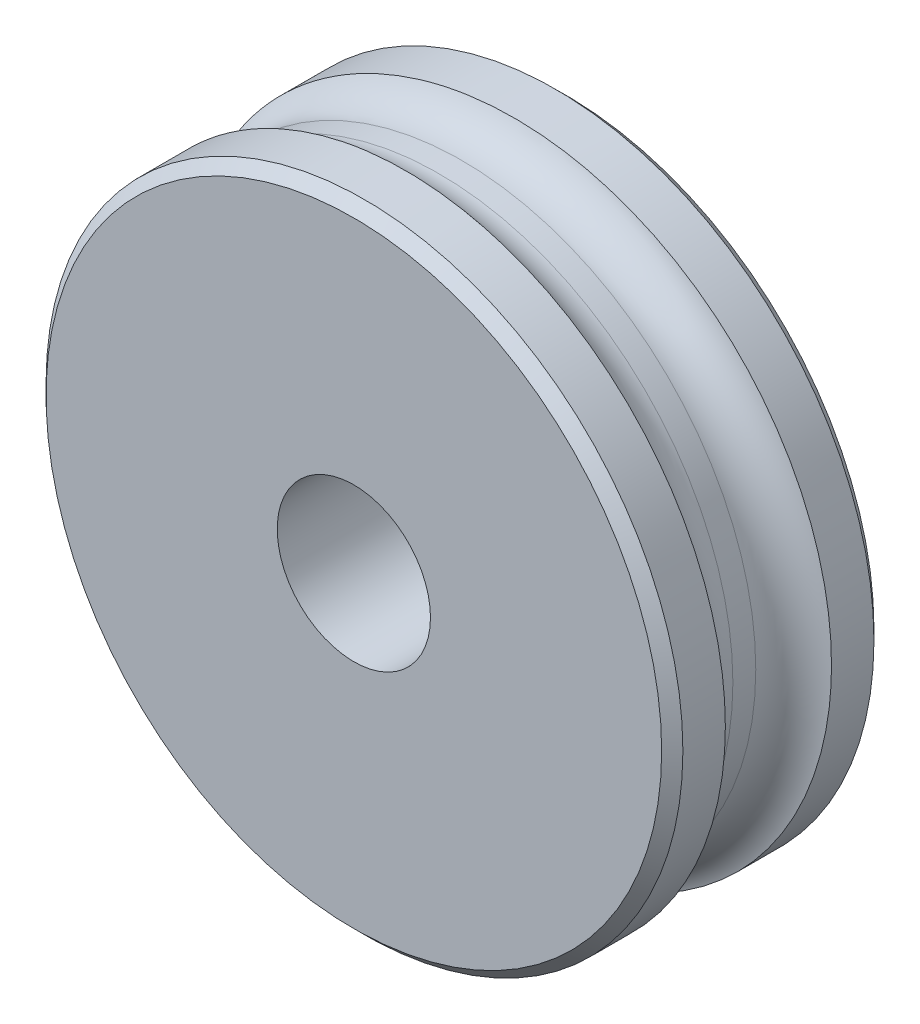
ISO-10303-21;
HEADER;
FILE_DESCRIPTION(('STEP AP214'),'2;1');
FILE_NAME('part.step','',(''),(''),'','','');
FILE_SCHEMA(('AUTOMOTIVE_DESIGN { 1 0 10303 214 1 1 1 1 }'));
ENDSEC;
DATA;
#1=APPLICATION_CONTEXT('core data for automotive mechanical design processes');
#2=APPLICATION_PROTOCOL_DEFINITION('international standard','automotive_design',2000,#1);
#3=PRODUCT_CONTEXT('',#1,'mechanical');
#4=PRODUCT('Part','Part','',(#3));
#5=PRODUCT_RELATED_PRODUCT_CATEGORY('part','',(#4));
#6=PRODUCT_DEFINITION_FORMATION('','',#4);
#7=PRODUCT_DEFINITION_CONTEXT('part definition',#1,'design');
#8=PRODUCT_DEFINITION('design','',#6,#7);
#9=PRODUCT_DEFINITION_SHAPE('','',#8);
#10=(LENGTH_UNIT() NAMED_UNIT(*) SI_UNIT(.MILLI.,.METRE.));
#11=(NAMED_UNIT(*) PLANE_ANGLE_UNIT() SI_UNIT($,.RADIAN.));
#12=(NAMED_UNIT(*) SI_UNIT($,.STERADIAN.) SOLID_ANGLE_UNIT());
#13=UNCERTAINTY_MEASURE_WITH_UNIT(LENGTH_MEASURE(1.E-05),#10,'distance_accuracy_value','');
#14=(GEOMETRIC_REPRESENTATION_CONTEXT(3) GLOBAL_UNCERTAINTY_ASSIGNED_CONTEXT((#13)) GLOBAL_UNIT_ASSIGNED_CONTEXT((#10,
#11,#12)) REPRESENTATION_CONTEXT('',''));
#15=CARTESIAN_POINT('',(0.,0.,0.));
#16=DIRECTION('',(0.,0.,1.));
#17=DIRECTION('',(1.,0.,0.));
#18=AXIS2_PLACEMENT_3D('',#15,#16,#17);
#19=CARTESIAN_POINT('',(-297.670899950721,626.415366790637,-139.445627484166));
#20=DIRECTION('',(0.,0.,1.));
#21=DIRECTION('',(1.,0.,0.));
#22=AXIS2_PLACEMENT_3D('',#19,#20,#21);
#23=CYLINDRICAL_SURFACE('',#22,59.9999999997861);
#24=CARTESIAN_POINT('',(-297.670899950721,626.415366790637,32.26));
#25=DIRECTION('',(0.,0.,1.));
#26=DIRECTION('',(1.,0.,0.));
#27=AXIS2_PLACEMENT_3D('',#24,#25,#26);
#28=CIRCLE('',#27,59.9999999997861);
#29=CARTESIAN_POINT('',(-237.670899950935,626.415366790637,32.26));
#30=VERTEX_POINT('',#29);
#31=EDGE_CURVE('E50',#30,#30,#28,.T.);
#32=ORIENTED_EDGE('',*,*,#31,.T.);
#33=EDGE_LOOP('',(#32));
#34=FACE_BOUND('',#33,.T.);
#35=CARTESIAN_POINT('',(-336.420477547887,580.606303975343,41.5272521517537));
#36=CARTESIAN_POINT('',(-335.390338737614,579.734915453957,41.5051684799978));
#37=CARTESIAN_POINT('',(-334.330806938694,578.898308766413,41.4828163092265));
#38=CARTESIAN_POINT('',(-332.70125401925,577.698537391911,41.4490363728457));
#39=CARTESIAN_POINT('',(-332.151356937595,577.30780110102,41.4377343757435));
#40=CARTESIAN_POINT('',(-331.038617325716,576.545029715684,41.415066736645));
#41=CARTESIAN_POINT('',(-330.47577276904,576.172997578115,41.4037010848993));
#42=CARTESIAN_POINT('',(-328.76848522588,575.085441406517,41.3695378593218));
#43=CARTESIAN_POINT('',(-327.605560322874,574.398657823888,41.3466796629169));
#44=CARTESIAN_POINT('',(-325.235986466903,573.105065414893,41.3009835214889));
#45=CARTESIAN_POINT('',(-324.029334894191,572.498261390387,41.2781455777633));
#46=CARTESIAN_POINT('',(-322.037956682287,571.579630264985,41.2411915939157));
#47=CARTESIAN_POINT('',(-321.264782511037,571.242548122738,41.2270179736366));
#48=CARTESIAN_POINT('',(-319.705014341062,570.601312837427,41.1987812408852));
#49=CARTESIAN_POINT('',(-318.918422550075,570.297154336461,41.1847181107784));
#50=CARTESIAN_POINT('',(-317.332945731991,569.722200320451,41.1567324552621));
#51=CARTESIAN_POINT('',(-316.534058211142,569.451411676331,41.1428099593494));
#52=CARTESIAN_POINT('',(-314.925596721631,568.943748118392,41.1151414099863));
#53=CARTESIAN_POINT('',(-314.116022296382,568.706874658725,41.1013953641243));
#54=CARTESIAN_POINT('',(-311.672676997128,568.047604036124,41.0604559653316));
#55=CARTESIAN_POINT('',(-310.02467139317,567.676697035878,41.0335681935529));
#56=CARTESIAN_POINT('',(-306.703533276097,567.075157439392,40.9808426819324));
#57=CARTESIAN_POINT('',(-305.030401682049,566.844519725079,40.9550049038112));
#58=CARTESIAN_POINT('',(-301.670921640349,566.525085333743,40.9045567373098));
#59=CARTESIAN_POINT('',(-299.984575988505,566.436259425484,40.879946096997));
#60=CARTESIAN_POINT('',(-296.61037905059,566.401017658774,40.8320893663977));
#61=CARTESIAN_POINT('',(-294.922527751608,566.454603033484,40.808843287929));
#62=CARTESIAN_POINT('',(-291.557516027334,566.703789222089,40.7638249257233));
#63=CARTESIAN_POINT('',(-289.880354373483,566.899373407962,40.7420524697519));
#64=CARTESIAN_POINT('',(-286.548458324711,567.43115378131,40.7000522379598));
#65=CARTESIAN_POINT('',(-284.893723880575,567.767349660161,40.6798244587488));
#66=CARTESIAN_POINT('',(-281.618555561482,568.577939551472,40.6409580301012));
#67=CARTESIAN_POINT('',(-279.99811940007,569.052324320404,40.6223192744817));
#68=CARTESIAN_POINT('',(-276.802957310503,570.135931921532,40.5866449817444));
#69=CARTESIAN_POINT('',(-275.228231403314,570.745154815567,40.5696094453618));
#70=CARTESIAN_POINT('',(-272.135662812471,572.094121979662,40.537132461471));
#71=CARTESIAN_POINT('',(-270.617821145544,572.833868581301,40.5216910424468));
#72=CARTESIAN_POINT('',(-267.649847158901,574.438618034869,40.492372769712));
#73=CARTESIAN_POINT('',(-266.199714829011,575.303620867973,40.4784959157663));
#74=CARTESIAN_POINT('',(-263.377620620415,577.15263779429,40.4522608007537));
#75=CARTESIAN_POINT('',(-262.005650655969,578.136639544293,40.4399023824541));
#76=CARTESIAN_POINT('',(-259.349475732921,580.216730915203,40.4166413993295));
#77=CARTESIAN_POINT('',(-258.065270769385,581.31282052981,40.4057388344228));
#78=CARTESIAN_POINT('',(-255.593760521462,583.609293951825,40.3853184729911));
#79=CARTESIAN_POINT('',(-254.406455101152,584.809677612934,40.3758006745237));
#80=CARTESIAN_POINT('',(-252.137185686356,587.306206418373,40.3580724134901));
#81=CARTESIAN_POINT('',(-251.055221690575,588.602351561526,40.3498619509078));
#82=CARTESIAN_POINT('',(-249.004372696069,591.28113181703,40.3346685501663));
#83=CARTESIAN_POINT('',(-248.035482955486,592.663763298771,40.3276855605258));
#84=CARTESIAN_POINT('',(-246.217619619523,595.505735583946,40.3148673208376));
#85=CARTESIAN_POINT('',(-245.368646020194,596.965076384855,40.309032070752));
#86=CARTESIAN_POINT('',(-243.796652408752,599.950091072501,40.2984339269994));
#87=CARTESIAN_POINT('',(-243.073632300577,601.475764908646,40.2936710325145));
#88=CARTESIAN_POINT('',(-241.758686005468,604.582599934088,40.2851491437985));
#89=CARTESIAN_POINT('',(-241.16675981884,606.163761123514,40.2813901495697));
#90=CARTESIAN_POINT('',(-240.118215211914,609.370314426313,40.2748171552226));
#91=CARTESIAN_POINT('',(-239.661595518087,610.995706123225,40.27200314621));
#92=CARTESIAN_POINT('',(-238.88690310518,614.279179141533,40.2672728490697));
#93=CARTESIAN_POINT('',(-238.568830384966,615.937260462663,40.2653565609346));
#94=CARTESIAN_POINT('',(-238.073493367225,619.274325528822,40.2623878966913));
#95=CARTESIAN_POINT('',(-237.896229133147,620.953309283271,40.2613355209724));
#96=CARTESIAN_POINT('',(-237.683769702923,624.320241921251,40.2600755257337));
#97=CARTESIAN_POINT('',(-237.64857450717,626.008190804808,40.2598679062162));
#98=CARTESIAN_POINT('',(-237.720503401451,629.381053579742,40.2602935876915));
#99=CARTESIAN_POINT('',(-237.827627506833,631.065967470792,40.2609268887748));
#100=CARTESIAN_POINT('',(-238.183433361709,634.420781350639,40.2630460501652));
#101=CARTESIAN_POINT('',(-238.432115111081,636.090681339449,40.2645319104715));
#102=CARTESIAN_POINT('',(-239.069268022492,639.403595121794,40.2683828709181));
#103=CARTESIAN_POINT('',(-239.457739159166,641.046608920205,40.2707479708989));
#104=CARTESIAN_POINT('',(-240.371708725979,644.29406977884,40.276398191295));
#105=CARTESIAN_POINT('',(-240.897207156044,645.898516839084,40.2796833117099));
#106=CARTESIAN_POINT('',(-242.08149484802,649.057437581984,40.2872269601124));
#107=CARTESIAN_POINT('',(-242.740284112084,650.611911263833,40.2914854881156));
#108=CARTESIAN_POINT('',(-244.18646917881,653.659833858136,40.3010400009439));
#109=CARTESIAN_POINT('',(-244.973864981333,655.153282770655,40.3063359857678));
#110=CARTESIAN_POINT('',(-246.671664294797,658.06853838403,40.3180377114671));
#111=CARTESIAN_POINT('',(-247.582067806487,659.490345084449,40.3244434523492));
#112=CARTESIAN_POINT('',(-249.51940892359,662.252208260078,40.3384424768131));
#113=CARTESIAN_POINT('',(-250.54634652889,663.592264735365,40.3460357603936));
#114=CARTESIAN_POINT('',(-252.709453244775,666.181100594274,40.3624900279762));
#115=CARTESIAN_POINT('',(-253.845622333965,667.429879995772,40.37135101173));
#116=CARTESIAN_POINT('',(-256.219112963788,669.827284591884,40.3904198731803));
#117=CARTESIAN_POINT('',(-257.456434503997,670.975909786916,40.4006277508713));
#118=CARTESIAN_POINT('',(-260.023431361182,673.164840922984,40.4224650646027));
#119=CARTESIAN_POINT('',(-261.353106671435,674.205146871905,40.4340945005396));
#120=CARTESIAN_POINT('',(-264.095355830794,676.170045224946,40.458841417729));
#121=CARTESIAN_POINT('',(-265.507929680625,677.094637628054,40.4719588989945));
#122=CARTESIAN_POINT('',(-268.405946409601,678.821546799307,40.4997366212108));
#123=CARTESIAN_POINT('',(-269.891390053005,679.62386228465,40.5143968783442));
#124=CARTESIAN_POINT('',(-272.924569801743,681.100504692142,40.5452989920591));
#125=CARTESIAN_POINT('',(-274.472305906972,681.774831614507,40.5615408486381));
#126=CARTESIAN_POINT('',(-277.619065192165,682.990706242801,40.5956258412935));
#127=CARTESIAN_POINT('',(-279.218088372171,683.532253948617,40.6134689773714));
#128=CARTESIAN_POINT('',(-282.456052390522,684.478724154079,40.6507534482883));
#129=CARTESIAN_POINT('',(-284.094993230371,684.883646648576,40.6701947831877));
#130=CARTESIAN_POINT('',(-287.401215071871,685.554007482414,40.7106474117194));
#131=CARTESIAN_POINT('',(-289.068497353654,685.819439503848,40.7316587764134));
#132=CARTESIAN_POINT('',(-292.419475822244,686.208909342816,40.7751924373413));
#133=CARTESIAN_POINT('',(-294.10317200937,686.332947157614,40.7977147336044));
#134=CARTESIAN_POINT('',(-297.475009860781,686.438751815856,40.8441802295121));
#135=CARTESIAN_POINT('',(-299.16315152731,686.420518587456,40.8681234298742));
#136=CARTESIAN_POINT('',(-302.531880088178,686.24191550201,40.9173066639237));
#137=CARTESIAN_POINT('',(-304.212466981945,686.0815456342,40.9425466977094));
#138=CARTESIAN_POINT('',(-307.554305378687,685.619791039846,40.9941663101762));
#139=CARTESIAN_POINT('',(-309.215554972756,685.318392510455,41.0205460001692));
#140=CARTESIAN_POINT('',(-312.506743585365,684.576722034981,41.0742459175582));
#141=CARTESIAN_POINT('',(-314.13668260197,684.136450080319,41.1015661450125));
#142=CARTESIAN_POINT('',(-317.353666767785,683.120165062926,41.1569132680182));
#143=CARTESIAN_POINT('',(-318.940711901231,682.544151950312,41.1849401638294));
#144=CARTESIAN_POINT('',(-322.060629688501,681.260480601453,41.2414301576758));
#145=CARTESIAN_POINT('',(-323.593502338309,680.552822355445,41.2698932557434));
#146=CARTESIAN_POINT('',(-326.59435398994,679.010802568479,41.3269535114664));
#147=CARTESIAN_POINT('',(-328.062325564293,678.176426573777,41.3555506840536));
#148=CARTESIAN_POINT('',(-330.922755124868,676.386960617205,41.4125382868284));
#149=CARTESIAN_POINT('',(-332.315213104064,675.431870644102,41.4409287169967));
#150=CARTESIAN_POINT('',(-335.014719206701,673.407762483595,41.4971374731274));
#151=CARTESIAN_POINT('',(-336.321767238814,672.338744174369,41.524955798478));
#152=CARTESIAN_POINT('',(-338.841159950071,670.094375750459,41.579632917506));
#153=CARTESIAN_POINT('',(-340.053504631265,668.919025638076,41.6064917112041));
#154=CARTESIAN_POINT('',(-342.374887504666,666.470326226705,41.6588481653578));
#155=CARTESIAN_POINT('',(-343.483924162075,665.196975472279,41.684345805589));
#156=CARTESIAN_POINT('',(-345.590782272501,662.561338029531,41.7335719850688));
#157=CARTESIAN_POINT('',(-346.588603720774,661.199051337415,41.7573005242418));
#158=CARTESIAN_POINT('',(-348.465931826734,658.395222817103,41.802586009785));
#159=CARTESIAN_POINT('',(-349.345438426019,656.953680949785,41.824142955083));
#160=CARTESIAN_POINT('',(-350.979875315718,654.00158980506,41.8646996269861));
#161=CARTESIAN_POINT('',(-351.734805629955,652.49104054085,41.88369935408));
#162=CARTESIAN_POINT('',(-353.114584619525,649.41196276746,41.9187822494819));
#163=CARTESIAN_POINT('',(-353.739457570809,647.843445142886,41.9348659620084));
#164=CARTESIAN_POINT('',(-354.854848795185,644.659316107692,41.9638077215857));
#165=CARTESIAN_POINT('',(-355.345367071352,643.043704698149,41.9766657687105));
#166=CARTESIAN_POINT('',(-356.188546313836,639.776906576751,41.9988971587921));
#167=CARTESIAN_POINT('',(-356.541209679916,638.125720484704,42.0082705624091));
#168=CARTESIAN_POINT('',(-357.106177226172,634.799492024466,42.0233395846539));
#169=CARTESIAN_POINT('',(-357.318481501195,633.124449672396,42.0290352057671));
#170=CARTESIAN_POINT('',(-357.60116830827,629.763013576818,42.0366278696003));
#171=CARTESIAN_POINT('',(-357.67160041093,628.076624004777,42.0385262390913));
#172=CARTESIAN_POINT('',(-357.670188986112,624.703900481741,42.0384882420264));
#173=CARTESIAN_POINT('',(-357.598345225108,623.017566530843,42.0365518691763));
#174=CARTESIAN_POINT('',(-357.312882221131,619.656789913627,42.0288849947053));
#175=CARTESIAN_POINT('',(-357.099249251165,617.982348414515,42.0231541257291));
#176=CARTESIAN_POINT('',(-356.531709275388,614.657423038535,42.0080178547962));
#177=CARTESIAN_POINT('',(-356.177803345394,613.006938978028,41.9986124810209));
#178=CARTESIAN_POINT('',(-355.332248367421,609.741619298684,41.9763213441104));
#179=CARTESIAN_POINT('',(-354.84059085971,608.126785875832,41.9634353672228));
#180=CARTESIAN_POINT('',(-353.722892674342,604.944038811823,41.9344386011697));
#181=CARTESIAN_POINT('',(-353.096847660406,603.376126686534,41.9183277079471));
#182=CARTESIAN_POINT('',(-352.060767344543,601.068695210759,41.8919892522125));
#183=CARTESIAN_POINT('',(-351.699269583944,600.307013676227,41.8828485244787));
#184=CARTESIAN_POINT('',(-350.944502943415,598.799547780111,41.8638845312272));
#185=CARTESIAN_POINT('',(-350.551235520257,598.053762691588,41.8540612970082));
#186=CARTESIAN_POINT('',(-349.733710134164,596.579581262885,41.8337797043477));
#187=CARTESIAN_POINT('',(-349.309458178502,595.85118158817,41.8233214690861));
#188=CARTESIAN_POINT('',(-348.430593831908,594.412803915703,41.8018140244754));
#189=CARTESIAN_POINT('',(-347.975976156842,593.702829154194,41.7907647123363));
#190=CARTESIAN_POINT('',(-346.732122016818,591.847606892945,41.7607666788547));
#191=CARTESIAN_POINT('',(-345.917415883291,590.719313846622,41.7413505809947));
#192=CARTESIAN_POINT('',(-344.211603492789,588.522133665454,41.7012702957898));
#193=CARTESIAN_POINT('',(-343.320501421536,587.453243281227,41.6806061768419));
#194=CARTESIAN_POINT('',(-341.930141527345,585.898668029121,41.6488528716053));
#195=CARTESIAN_POINT('',(-341.457812136531,585.388676002139,41.6381439154487));
#196=CARTESIAN_POINT('',(-340.495806021373,584.385492888441,41.6165013623766));
#197=CARTESIAN_POINT('',(-340.006132198139,583.892299018808,41.6055678031566));
#198=CARTESIAN_POINT('',(-338.511780048808,582.43862692719,41.5724683797096));
#199=CARTESIAN_POINT('',(-337.481726359101,581.5040082684,41.5500027462992));
#200=CARTESIAN_POINT('',(-336.420477547887,580.606303975343,41.5272521517537));
#201=B_SPLINE_CURVE_WITH_KNOTS('',3,(#35,#36,#37,#38,#39,#40,#41,#42,#43,#44,#45,#46,#47,#48,
#49,#50,#51,#52,#53,#54,#55,#56,#57,#58,#59,#60,#61,#62,#63,#64,#65,#66,#67,#68,#69,#70,#71,#72,
#73,#74,#75,#76,#77,#78,#79,#80,#81,#82,#83,#84,#85,#86,#87,#88,#89,#90,#91,#92,#93,#94,#95,#96,
#97,#98,#99,#100,#101,#102,#103,#104,#105,#106,#107,#108,#109,#110,#111,#112,#113,#114,#115,
#116,#117,#118,#119,#120,#121,#122,#123,#124,#125,#126,#127,#128,#129,#130,#131,#132,#133,#134,
#135,#136,#137,#138,#139,#140,#141,#142,#143,#144,#145,#146,#147,#148,#149,#150,#151,#152,#153,
#154,#155,#156,#157,#158,#159,#160,#161,#162,#163,#164,#165,#166,#167,#168,#169,#170,#171,#172,
#173,#174,#175,#176,#177,#178,#179,#180,#181,#182,#183,#184,#185,#186,#187,#188,#189,#190,#191,
#192,#193,#194,#195,#196,#197,#198,#199,#200),.UNSPECIFIED.,.T.,.F.,(4,2,2,2,2,2,2,2,2,2,2,2,2,
2,2,2,2,2,2,2,2,2,2,2,2,2,2,2,2,2,2,2,2,2,2,2,2,2,2,2,2,2,2,2,2,2,2,2,2,2,2,2,2,2,2,2,2,2,2,2,2,
2,2,2,2,2,2,2,2,2,2,2,2,2,2,2,2,2,2,2,2,2,4),(0.,4.04733716065738,6.0710311012607,
8.09504396133172,12.1440808352644,16.1933606971156,18.7234154091434,21.253057766082,
23.7832201144919,26.3134909139511,31.3752646266868,36.4368536369652,41.4973991825635,
46.5579885483559,51.617985416098,56.67797117789,61.7376185522851,66.7972682471631,
71.8570083330442,76.9167476585177,81.9759626099959,87.0351772770949,92.0943848474532,
97.1535923555716,102.212587625528,107.271582728886,112.330573973842,117.389565230609,
122.448508869765,127.507452467535,132.566398344907,137.625344236301,142.684290673261,
147.743237105834,152.802182620431,157.861128132261,162.920073725787,167.979019313899,
173.0379649329,178.096910547069,183.155855170433,188.214799772657,193.273744006625,
198.332688284837,203.391685632554,208.450682971766,213.509680315249,218.568677849353,
223.627904499572,228.687131247675,233.746360550628,238.80559023669,243.865315186479,
248.925040448807,253.984767570501,259.04449506742,264.10480012358,269.165105650603,
274.225416588573,279.285727417022,284.346113412161,289.406499623215,294.466888332192,
299.527276073497,304.586718415688,309.646160642074,314.705514790347,319.764865519748,
324.822448188266,329.880039158054,334.938119838207,339.996161726431,345.054514312096,
350.113030140078,352.641903883763,355.17066173376,357.698930603884,360.227640586481,
364.399583650675,368.571298280574,370.656528754784,372.741412075654,376.910978067632),.UNSPECIFIED.);
#202=CARTESIAN_POINT('',(-336.420477547887,580.606303975343,41.5272521517537));
#203=VERTEX_POINT('',#202);
#204=EDGE_CURVE('E60',#203,#203,#201,.T.);
#205=ORIENTED_EDGE('',*,*,#204,.F.);
#206=EDGE_LOOP('',(#205));
#207=FACE_BOUND('',#206,.T.);
#208=ADVANCED_FACE('F38',(#34,#207),#23,.T.);
#209=CARTESIAN_POINT('',(-297.670899950721,626.415366790637,68.2599999999999));
#210=DIRECTION('',(0.,0.,1.));
#211=DIRECTION('',(1.,0.,0.));
#212=AXIS2_PLACEMENT_3D('',#209,#210,#211);
#213=CIRCLE('',#212,59.9999999997861);
#214=CARTESIAN_POINT('',(-237.670899950935,626.415366790637,68.2599999999999));
#215=VERTEX_POINT('',#214);
#216=EDGE_CURVE('E10',#215,#215,#213,.F.);
#217=ORIENTED_EDGE('',*,*,#216,.T.);
#218=EDGE_LOOP('',(#217));
#219=FACE_BOUND('',#218,.T.);
#220=CARTESIAN_POINT('',(-336.420477547805,580.606303975274,58.9927478487613));
#221=CARTESIAN_POINT('',(-337.450620655545,581.477694020244,58.9706641128549));
#222=CARTESIAN_POINT('',(-338.451343481215,582.383843219325,58.9488494527151));
#223=CARTESIAN_POINT('',(-339.904735246666,583.791918516593,58.9166871732661));
#224=CARTESIAN_POINT('',(-340.381253168713,584.26942190998,58.9060596358112));
#225=CARTESIAN_POINT('',(-341.317995583324,585.240299747961,58.8850138582152));
#226=CARTESIAN_POINT('',(-341.778217494307,585.733676683789,58.8745956513479));
#227=CARTESIAN_POINT('',(-343.133849228034,587.237038711934,58.8436891836499));
#228=CARTESIAN_POINT('',(-344.003984019641,588.270021486686,58.8235544235431));
#229=CARTESIAN_POINT('',(-345.672640321216,590.392383962595,58.7844415386446));
#230=CARTESIAN_POINT('',(-346.471157543313,591.481767034388,58.7654634831286));
#231=CARTESIAN_POINT('',(-347.707178045378,593.293139196627,58.7357417956862));
#232=CARTESIAN_POINT('',(-348.167680140879,593.99953660754,58.7245813117755));
#233=CARTESIAN_POINT('',(-349.058454689644,595.431021137997,58.7028423831054));
#234=CARTESIAN_POINT('',(-349.488732058735,596.156105191955,58.692263843758));
#235=CARTESIAN_POINT('',(-350.318441994052,597.623924724379,58.6717327660234));
#236=CARTESIAN_POINT('',(-350.717868209187,598.36666379641,58.6617803566105));
#237=CARTESIAN_POINT('',(-351.485066134556,599.868301215992,58.6425497664613));
#238=CARTESIAN_POINT('',(-351.852836486955,600.627200254961,58.6332716146488));
#239=CARTESIAN_POINT('',(-352.907958653091,602.926827109907,58.6065074554249));
#240=CARTESIAN_POINT('',(-353.546919730128,604.490127506861,58.5900967658769));
#241=CARTESIAN_POINT('',(-354.690743090444,607.664763912651,58.5604746884936));
#242=CARTESIAN_POINT('',(-355.195610261368,609.2760981683,58.5472631840515));
#243=CARTESIAN_POINT('',(-356.067717102233,612.535295138227,58.5243029717873));
#244=CARTESIAN_POINT('',(-356.434987148252,614.183149705067,58.5145534997083));
#245=CARTESIAN_POINT('',(-357.029405974533,617.503956690559,58.4987148133027));
#246=CARTESIAN_POINT('',(-357.256553543724,619.176909326004,58.4926256306118));
#247=CARTESIAN_POINT('',(-357.56909446038,622.535818924729,58.4842354439176));
#248=CARTESIAN_POINT('',(-357.65450447044,624.221774335994,58.4819339946306));
#249=CARTESIAN_POINT('',(-357.683010567931,627.594883964857,58.4811665952916));
#250=CARTESIAN_POINT('',(-357.626106979565,629.282038179716,58.4827006365021));
#251=CARTESIAN_POINT('',(-357.370419042681,632.645206654404,58.4895710314839));
#252=CARTESIAN_POINT('',(-357.171663667745,634.321223118601,58.4949066087816));
#253=CARTESIAN_POINT('',(-356.633719735637,637.650549718063,58.5092672608607));
#254=CARTESIAN_POINT('',(-356.294531130546,639.30385984558,58.518292336901));
#255=CARTESIAN_POINT('',(-355.478129159959,642.576051847318,58.5398457696898));
#256=CARTESIAN_POINT('',(-355.000913267728,644.194933090699,58.5523741905706));
#257=CARTESIAN_POINT('',(-353.911856999928,647.386731962916,58.5806815556761));
#258=CARTESIAN_POINT('',(-353.300016619427,648.959649590067,58.5964605000198));
#259=CARTESIAN_POINT('',(-351.946024794897,652.048440678617,58.6309616104294));
#260=CARTESIAN_POINT('',(-351.203865450223,653.564310674709,58.649683954933));
#261=CARTESIAN_POINT('',(-349.59454118821,656.528138698331,58.6897192229543));
#262=CARTESIAN_POINT('',(-348.727376269033,657.976096724865,58.7110321465101));
#263=CARTESIAN_POINT('',(-346.87420741003,660.793819113713,58.7558658909552));
#264=CARTESIAN_POINT('',(-345.888203457121,662.16358346742,58.7793867120877));
#265=CARTESIAN_POINT('',(-343.804365260995,664.815194077266,58.8282355027713));
#266=CARTESIAN_POINT('',(-342.706530991477,666.097040312728,58.8535634727474));
#267=CARTESIAN_POINT('',(-340.406482154184,668.56409181211,58.9056276113201));
#268=CARTESIAN_POINT('',(-339.204235876039,669.74926750336,58.9323642067455));
#269=CARTESIAN_POINT('',(-336.70419549237,672.014125399242,58.9868357968544));
#270=CARTESIAN_POINT('',(-335.406401368801,673.093807583951,59.0145707917264));
#271=CARTESIAN_POINT('',(-332.724487314153,675.140010613359,59.0706502321557));
#272=CARTESIAN_POINT('',(-331.340367358789,676.106531426223,59.0989946778844));
#273=CARTESIAN_POINT('',(-328.495636352822,677.919546290983,59.1559253803929));
#274=CARTESIAN_POINT('',(-327.035025294947,678.766040331468,59.1845116371957));
#275=CARTESIAN_POINT('',(-324.047369742755,680.333155428771,59.2415917189929));
#276=CARTESIAN_POINT('',(-322.5203111205,681.053749552068,59.2700855229325));
#277=CARTESIAN_POINT('',(-319.410905260844,682.363720448904,59.3266656989654));
#278=CARTESIAN_POINT('',(-317.828558014453,682.95309720111,59.3547520709924));
#279=CARTESIAN_POINT('',(-314.619821343992,683.996441845778,59.410243274101));
#280=CARTESIAN_POINT('',(-312.993431893368,684.450409656602,59.4376481047717));
#281=CARTESIAN_POINT('',(-309.708173162731,685.219705392551,59.4915385632812));
#282=CARTESIAN_POINT('',(-308.049303884496,685.535033325267,59.5180241911704));
#283=CARTESIAN_POINT('',(-304.710876169162,686.024803818572,59.5698758256326));
#284=CARTESIAN_POINT('',(-303.031317698336,686.199246149466,59.5952418303803));
#285=CARTESIAN_POINT('',(-299.663456291359,686.405999628497,59.6446906361482));
#286=CARTESIAN_POINT('',(-297.97515335499,686.438310773095,59.6687734371365));
#287=CARTESIAN_POINT('',(-294.601809800723,686.360567236885,59.7155282100458));
#288=CARTESIAN_POINT('',(-292.916769180974,686.250512636895,59.7382001827677));
#289=CARTESIAN_POINT('',(-289.561933394195,685.888815467457,59.782039947178));
#290=CARTESIAN_POINT('',(-287.892138225749,685.637172911164,59.8032077390061));
#291=CARTESIAN_POINT('',(-284.579852687277,684.99412024758,59.8439755888847));
#292=CARTESIAN_POINT('',(-282.937359330506,684.602725535528,59.8635758193283));
#293=CARTESIAN_POINT('',(-279.69117011102,683.682942698682,59.9011792382514));
#294=CARTESIAN_POINT('',(-278.087474245861,683.154554582521,59.9191824268315));
#295=CARTESIAN_POINT('',(-274.930286724255,681.964538717991,59.9535862583359));
#296=CARTESIAN_POINT('',(-273.376795049068,681.302911019363,59.9699869018583));
#297=CARTESIAN_POINT('',(-270.331065014584,679.851117640694,60.0012032616753));
#298=CARTESIAN_POINT('',(-268.838826651784,679.060951968005,60.0160189780604));
#299=CARTESIAN_POINT('',(-265.926366415584,677.357786248926,60.0441012964378));
#300=CARTESIAN_POINT('',(-264.506137208069,676.444798746654,60.0573680563709));
#301=CARTESIAN_POINT('',(-261.747632311989,674.502416925645,60.0824074283348));
#302=CARTESIAN_POINT('',(-260.409356617753,673.473022614965,60.0941800404689));
#303=CARTESIAN_POINT('',(-257.824276688012,671.305145102073,60.1162966158832));
#304=CARTESIAN_POINT('',(-256.577472431727,670.166661924646,60.1266405794879));
#305=CARTESIAN_POINT('',(-254.184202179727,667.788700324407,60.1459739049578));
#306=CARTESIAN_POINT('',(-253.037736182403,666.549221903217,60.1549632668448));
#307=CARTESIAN_POINT('',(-250.853350801833,663.978146784342,60.1716658948136));
#308=CARTESIAN_POINT('',(-249.815425972885,662.646554713739,60.1793792249277));
#309=CARTESIAN_POINT('',(-247.855437880163,659.900663656485,60.1936105555898));
#310=CARTESIAN_POINT('',(-246.933374612012,658.486364672959,60.200128556183));
#311=CARTESIAN_POINT('',(-245.211666407977,655.585114790942,60.2120473898136));
#312=CARTESIAN_POINT('',(-244.412021459564,654.098163899887,60.2174482229652));
#313=CARTESIAN_POINT('',(-242.940835864925,651.062181575694,60.2272056859957));
#314=CARTESIAN_POINT('',(-242.269295218931,649.513150142442,60.2315623158728));
#315=CARTESIAN_POINT('',(-241.059101107982,646.364039966023,60.2392962902666));
#316=CARTESIAN_POINT('',(-240.520445934423,644.763961879496,60.2426736473747));
#317=CARTESIAN_POINT('',(-239.579841589485,641.524115063676,60.2485036690872));
#318=CARTESIAN_POINT('',(-239.177892416579,639.884346334826,60.250956333702));
#319=CARTESIAN_POINT('',(-238.513557984258,636.576775780765,60.2549790524373));
#320=CARTESIAN_POINT('',(-238.251172744193,634.908973951668,60.2565491064354));
#321=CARTESIAN_POINT('',(-237.867831870399,631.557194492025,60.25883470702));
#322=CARTESIAN_POINT('',(-237.746876237124,629.873216861427,60.2595502536037));
#323=CARTESIAN_POINT('',(-237.647254598915,626.501058122699,60.2601399702641));
#324=CARTESIAN_POINT('',(-237.668588573313,624.812877015178,60.260014140463));
#325=CARTESIAN_POINT('',(-237.85339441416,621.444313031573,60.2589187775896));
#326=CARTESIAN_POINT('',(-238.016866280436,619.763930155479,60.2579492445184));
#327=CARTESIAN_POINT('',(-238.484785510565,616.422909741151,60.2551487893581));
#328=CARTESIAN_POINT('',(-238.789232824393,614.76227219591,60.2533178675746));
#329=CARTESIAN_POINT('',(-239.536938250299,611.472547974136,60.2487622073508));
#330=CARTESIAN_POINT('',(-239.980196362309,609.843461297588,60.2460374689108));
#331=CARTESIAN_POINT('',(-241.002371747105,606.62842048891,60.2396481896688));
#332=CARTESIAN_POINT('',(-241.581289033337,605.042466361055,60.2359836487735));
#333=CARTESIAN_POINT('',(-242.870666421651,601.924966003029,60.2276568798219));
#334=CARTESIAN_POINT('',(-243.581126523671,600.393419772831,60.2229946517659));
#335=CARTESIAN_POINT('',(-245.128538197293,597.39562282107,60.2126048767182));
#336=CARTESIAN_POINT('',(-245.965489830405,595.929372131258,60.2068773292084));
#337=CARTESIAN_POINT('',(-247.759933058015,593.072591113711,60.1942820822828));
#338=CARTESIAN_POINT('',(-248.717424652357,591.682060785877,60.1874143828686));
#339=CARTESIAN_POINT('',(-250.746137918978,588.986607924933,60.1724597316973));
#340=CARTESIAN_POINT('',(-251.817359435455,587.68168527455,60.1643727816106));
#341=CARTESIAN_POINT('',(-254.065916316605,585.166722403362,60.1468994285588));
#342=CARTESIAN_POINT('',(-255.243251680933,583.956682182247,60.1375130255979));
#343=CARTESIAN_POINT('',(-257.695665679124,581.640084684404,60.1173629326121));
#344=CARTESIAN_POINT('',(-258.970744423521,580.533527524705,60.1065992410297));
#345=CARTESIAN_POINT('',(-261.609576907429,578.431763417379,60.0836227127477));
#346=CARTESIAN_POINT('',(-262.973330646773,577.436556469547,60.0714098760507));
#347=CARTESIAN_POINT('',(-265.779836322577,575.564552429807,60.045472668141));
#348=CARTESIAN_POINT('',(-267.222589430605,574.687757094624,60.0317482745087));
#349=CARTESIAN_POINT('',(-270.176815926035,573.058824901781,60.0027392816567));
#350=CARTESIAN_POINT('',(-271.68828931923,572.306688054629,59.9874546823056));
#351=CARTESIAN_POINT('',(-274.769184293113,570.932427949575,59.9552938037244));
#352=CARTESIAN_POINT('',(-276.338604970651,570.310302666354,59.9384175492951));
#353=CARTESIAN_POINT('',(-279.524257020821,569.200470354575,59.9030621081241));
#354=CARTESIAN_POINT('',(-281.140488373376,568.712763268365,59.8845829220699));
#355=CARTESIAN_POINT('',(-284.408268044205,567.875230497186,59.8460347070714));
#356=CARTESIAN_POINT('',(-286.059816302758,567.525404579076,59.8259656808153));
#357=CARTESIAN_POINT('',(-289.386495595219,566.966115057702,59.784278048221));
#358=CARTESIAN_POINT('',(-291.061626673261,566.756651717154,59.7626594389824));
#359=CARTESIAN_POINT('',(-294.423719741456,566.479557221059,59.7179411466108));
#360=CARTESIAN_POINT('',(-296.110682870943,566.411939917655,59.6948413190546));
#361=CARTESIAN_POINT('',(-299.484292140116,566.419060737817,59.6472656213475));
#362=CARTESIAN_POINT('',(-301.170938282113,566.49379777977,59.622789761653));
#363=CARTESIAN_POINT('',(-304.532288868,566.785102583922,59.572594917228));
#364=CARTESIAN_POINT('',(-306.206990176889,567.001706288688,59.5468756189964));
#365=CARTESIAN_POINT('',(-309.532443651721,567.575331663211,59.4943682446998));
#366=CARTESIAN_POINT('',(-311.183195040313,567.932357880188,59.4675801340493));
#367=CARTESIAN_POINT('',(-313.631608115038,568.571025860486,59.4267718576727));
#368=CARTESIAN_POINT('',(-314.44306647808,568.801081997108,59.4130658074797));
#369=CARTESIAN_POINT('',(-316.055579833504,569.295192286112,59.3854711079999));
#370=CARTESIAN_POINT('',(-316.856635301655,569.559244877617,59.3715824671227));
#371=CARTESIAN_POINT('',(-318.446740930239,570.120826235026,59.3436576828202));
#372=CARTESIAN_POINT('',(-319.235793382506,570.418348516845,59.3296215684412));
#373=CARTESIAN_POINT('',(-320.800768514033,571.046419661375,59.3014316573745));
#374=CARTESIAN_POINT('',(-321.576688874871,571.376974286145,59.2872778405513));
#375=CARTESIAN_POINT('',(-323.613973226409,572.296114582935,59.2496562430547));
#376=CARTESIAN_POINT('',(-324.862827280129,572.912688268704,59.2261182275429));
#377=CARTESIAN_POINT('',(-327.314578036302,574.231177835956,59.1790037065952));
#378=CARTESIAN_POINT('',(-328.51747725477,574.933089036409,59.1554272033403));
#379=CARTESIAN_POINT('',(-330.282602199412,576.047113021033,59.1201859918725));
#380=CARTESIAN_POINT('',(-330.864355269931,576.428585207364,59.1084612670906));
#381=CARTESIAN_POINT('',(-332.014153048546,577.211458205415,59.0850772723637));
#382=CARTESIAN_POINT('',(-332.582200025141,577.612855685204,59.0734179918356));
#383=CARTESIAN_POINT('',(-334.264962740441,578.846376696051,59.0385723659761));
#384=CARTESIAN_POINT('',(-335.35835769611,579.707865051227,59.015517087452));
#385=CARTESIAN_POINT('',(-336.420477547805,580.606303975274,58.9927478487613));
#386=B_SPLINE_CURVE_WITH_KNOTS('',3,(#220,#221,#222,#223,#224,#225,#226,#227,#228,#229,#230,
#231,#232,#233,#234,#235,#236,#237,#238,#239,#240,#241,#242,#243,#244,#245,#246,#247,#248,#249,
#250,#251,#252,#253,#254,#255,#256,#257,#258,#259,#260,#261,#262,#263,#264,#265,#266,#267,#268,
#269,#270,#271,#272,#273,#274,#275,#276,#277,#278,#279,#280,#281,#282,#283,#284,#285,#286,#287,
#288,#289,#290,#291,#292,#293,#294,#295,#296,#297,#298,#299,#300,#301,#302,#303,#304,#305,#306,
#307,#308,#309,#310,#311,#312,#313,#314,#315,#316,#317,#318,#319,#320,#321,#322,#323,#324,#325,
#326,#327,#328,#329,#330,#331,#332,#333,#334,#335,#336,#337,#338,#339,#340,#341,#342,#343,#344,
#345,#346,#347,#348,#349,#350,#351,#352,#353,#354,#355,#356,#357,#358,#359,#360,#361,#362,#363,
#364,#365,#366,#367,#368,#369,#370,#371,#372,#373,#374,#375,#376,#377,#378,#379,#380,#381,#382,
#383,#384,#385),.UNSPECIFIED.,.T.,.F.,(4,2,2,2,2,2,2,2,2,2,2,2,2,2,2,2,2,2,2,2,2,2,2,2,2,2,2,2,
2,2,2,2,2,2,2,2,2,2,2,2,2,2,2,2,2,2,2,2,2,2,2,2,2,2,2,2,2,2,2,2,2,2,2,2,2,2,2,2,2,2,2,2,2,2,2,2,
2,2,2,2,2,2,4),(0.,4.04734914703464,6.071048270755,8.09506656352247,12.1441080279276,
16.1933917540913,18.7226651864643,21.2515262943058,23.7809066194975,26.3103953849355,
31.3705998326667,36.4306198135738,41.4895220803186,46.5484680702234,51.606819290857,
56.6651589881108,61.7224658024567,66.7797743424801,71.837175467783,76.8945767783954,
81.9522848020951,87.0099929001131,92.0677015549348,97.1254113993224,102.184662699478,
107.243914955101,112.303168633959,117.362422793821,122.422757948294,127.483093925485,
132.543432953554,137.603771704591,142.664118705867,147.724465833143,152.784810087769,
157.845153872251,162.904940376047,167.964726561038,173.024510857191,178.084294863968,
183.143562493443,188.202829772761,193.262095902637,198.321361951273,203.380374045619,
208.439385948837,213.498397334355,218.557408729086,223.616355073131,228.675301360659,
233.734248349548,238.793195354657,243.852141624977,248.911087889191,253.970032358275,
259.028976824947,264.087921793042,269.146866758755,274.205814184569,279.264761603866,
284.323702092803,289.382642565246,294.441588758759,299.500534942867,304.559556172005,
309.618577827645,314.6775206681,319.736461338763,324.795393455296,329.85433504066,
334.913770639977,339.973167797613,345.033847272697,350.094690638293,352.624729629277,
355.154652500238,357.684086090474,360.213961680002,364.389328805563,368.564467002401,
370.651408076721,372.738001338197,376.910984531994),.UNSPECIFIED.);
#387=CARTESIAN_POINT('',(-336.420477547805,580.606303975274,58.9927478487613));
#388=VERTEX_POINT('',#387);
#389=EDGE_CURVE('E69',#388,#388,#386,.T.);
#390=ORIENTED_EDGE('',*,*,#389,.F.);
#391=EDGE_LOOP('',(#390));
#392=FACE_BOUND('',#391,.T.);
#393=ADVANCED_FACE('F75',(#219,#392),#23,.T.);
#394=CARTESIAN_POINT('',(-297.670899950721,626.415366790637,70.26));
#395=DIRECTION('',(0.,0.,1.));
#396=DIRECTION('',(1.,0.,0.));
#397=AXIS2_PLACEMENT_3D('',#394,#395,#396);
#398=PLANE('',#397);
#399=CARTESIAN_POINT('',(-297.670899950721,626.415366790637,70.26));
#400=DIRECTION('',(0.,0.,1.));
#401=DIRECTION('',(1.,0.,0.));
#402=AXIS2_PLACEMENT_3D('',#399,#400,#401);
#403=CIRCLE('',#402,57.9999999997861);
#404=CARTESIAN_POINT('',(-239.670899950935,626.415366790637,70.26));
#405=VERTEX_POINT('',#404);
#406=EDGE_CURVE('E46',#405,#405,#403,.T.);
#407=ORIENTED_EDGE('',*,*,#406,.T.);
#408=EDGE_LOOP('',(#407));
#409=FACE_BOUND('',#408,.T.);
#410=CARTESIAN_POINT('',(-297.670899950721,626.415366790637,70.26));
#411=DIRECTION('',(0.,0.,1.));
#412=DIRECTION('',(1.,0.,0.));
#413=AXIS2_PLACEMENT_3D('',#410,#411,#412);
#414=CIRCLE('',#413,14.4381275614833);
#415=CARTESIAN_POINT('',(-283.232772389238,626.415366790637,70.26));
#416=VERTEX_POINT('',#415);
#417=EDGE_CURVE('E68',#416,#416,#414,.T.);
#418=ORIENTED_EDGE('',*,*,#417,.F.);
#419=EDGE_LOOP('',(#418));
#420=FACE_BOUND('',#419,.T.);
#421=ADVANCED_FACE('F91',(#409,#420),#398,.T.);
#422=CARTESIAN_POINT('',(-297.670899950721,626.415366790637,-139.445627484166));
#423=DIRECTION('',(0.,0.,1.));
#424=DIRECTION('',(1.,0.,0.));
#425=AXIS2_PLACEMENT_3D('',#422,#423,#424);
#426=CYLINDRICAL_SURFACE('',#425,14.4381275614833);
#427=CARTESIAN_POINT('',(-297.670899950721,626.415366790637,30.26));
#428=DIRECTION('',(0.,0.,1.));
#429=DIRECTION('',(1.,0.,0.));
#430=AXIS2_PLACEMENT_3D('',#427,#428,#429);
#431=CIRCLE('',#430,14.4381275614833);
#432=CARTESIAN_POINT('',(-283.232772389238,626.415366790637,30.26));
#433=VERTEX_POINT('',#432);
#434=EDGE_CURVE('E59',#433,#433,#431,.F.);
#435=ORIENTED_EDGE('',*,*,#434,.T.);
#436=EDGE_LOOP('',(#435));
#437=FACE_BOUND('',#436,.T.);
#438=ORIENTED_EDGE('',*,*,#417,.T.);
#439=EDGE_LOOP('',(#438));
#440=FACE_BOUND('',#439,.T.);
#441=ADVANCED_FACE('F88',(#437,#440),#426,.F.);
#442=CARTESIAN_POINT('',(105.593709746925,-523.178523142196,30.26));
#443=DIRECTION('',(0.,0.,1.));
#444=DIRECTION('',(1.,0.,0.));
#445=AXIS2_PLACEMENT_3D('',#442,#443,#444);
#446=PLANE('',#445);
#447=CARTESIAN_POINT('',(-297.670899950721,626.415366790637,30.26));
#448=DIRECTION('',(0.,0.,1.));
#449=DIRECTION('',(1.,0.,0.));
#450=AXIS2_PLACEMENT_3D('',#447,#448,#449);
#451=CIRCLE('',#450,57.9999999997861);
#452=CARTESIAN_POINT('',(-239.670899950935,626.415366790637,30.26));
#453=VERTEX_POINT('',#452);
#454=EDGE_CURVE('E54',#453,#453,#451,.F.);
#455=ORIENTED_EDGE('',*,*,#454,.T.);
#456=EDGE_LOOP('',(#455));
#457=FACE_BOUND('',#456,.T.);
#458=ORIENTED_EDGE('',*,*,#434,.F.);
#459=EDGE_LOOP('',(#458));
#460=FACE_BOUND('',#459,.T.);
#461=ADVANCED_FACE('F84',(#457,#460),#446,.F.);
#462=CARTESIAN_POINT('',(-299.491656028007,626.415366790637,48.1033100725108));
#463=DIRECTION('',(0.,0.,1.));
#464=DIRECTION('',(1.,0.,0.));
#465=AXIS2_PLACEMENT_3D('',#462,#463,#464);
#466=TOROIDAL_SURFACE('',#465,63.3963473859573,8.00000001352355);
#467=ORIENTED_EDGE('',*,*,#204,.T.);
#468=EDGE_LOOP('',(#467));
#469=FACE_BOUND('',#468,.T.);
#470=CARTESIAN_POINT('',(-299.491656028007,626.415366790637,48.1033100589607));
#471=DIRECTION('',(0.,0.,1.));
#472=DIRECTION('',(1.,0.,0.));
#473=AXIS2_PLACEMENT_3D('',#470,#471,#472);
#474=CIRCLE('',#473,55.3963473724337);
#475=CARTESIAN_POINT('',(-244.095308655573,626.415366790637,48.1033100589607));
#476=VERTEX_POINT('',#475);
#477=EDGE_CURVE('E108',#476,#476,#474,.T.);
#478=ORIENTED_EDGE('',*,*,#477,.F.);
#479=EDGE_LOOP('',(#478));
#480=FACE_BOUND('',#479,.T.);
#481=ADVANCED_FACE('F78',(#469,#480),#466,.F.);
#482=CARTESIAN_POINT('',(-299.491656028007,626.415366790637,70.26));
#483=DIRECTION('',(0.,0.,1.));
#484=DIRECTION('',(1.,0.,0.));
#485=AXIS2_PLACEMENT_3D('',#482,#483,#484);
#486=CYLINDRICAL_SURFACE('',#485,55.3963473725241);
#487=CARTESIAN_POINT('',(-299.491656028007,626.415366790637,52.4166899816907));
#488=DIRECTION('',(0.,0.,1.));
#489=DIRECTION('',(1.,0.,0.));
#490=AXIS2_PLACEMENT_3D('',#487,#488,#489);
#491=CIRCLE('',#490,55.3963473726146);
#492=CARTESIAN_POINT('',(-244.095308655392,626.415366790637,52.4166899816907));
#493=VERTEX_POINT('',#492);
#494=EDGE_CURVE('E110',#493,#493,#491,.T.);
#495=ORIENTED_EDGE('',*,*,#494,.F.);
#496=EDGE_LOOP('',(#495));
#497=FACE_BOUND('',#496,.T.);
#498=ORIENTED_EDGE('',*,*,#477,.T.);
#499=EDGE_LOOP('',(#498));
#500=FACE_BOUND('',#499,.T.);
#501=ADVANCED_FACE('F83',(#497,#500),#486,.T.);
#502=CARTESIAN_POINT('',(-299.491656028007,626.415366790637,52.4166899282215));
#503=DIRECTION('',(0.,0.,1.));
#504=DIRECTION('',(1.,0.,0.));
#505=AXIS2_PLACEMENT_3D('',#502,#503,#504);
#506=TOROIDAL_SURFACE('',#505,63.3963473859592,8.00000001334461);
#507=ORIENTED_EDGE('',*,*,#389,.T.);
#508=EDGE_LOOP('',(#507));
#509=FACE_BOUND('',#508,.T.);
#510=ORIENTED_EDGE('',*,*,#494,.T.);
#511=EDGE_LOOP('',(#510));
#512=FACE_BOUND('',#511,.T.);
#513=ADVANCED_FACE('F124',(#509,#512),#506,.F.);
#514=CARTESIAN_POINT('',(-297.670899950721,626.415366790637,30.26));
#515=DIRECTION('',(0.,0.,1.));
#516=DIRECTION('',(1.,0.,0.));
#517=AXIS2_PLACEMENT_3D('',#514,#515,#516);
#518=CONICAL_SURFACE('',#517,57.9999999997861,0.785398163397447);
#519=ORIENTED_EDGE('',*,*,#31,.F.);
#520=EDGE_LOOP('',(#519));
#521=FACE_BOUND('',#520,.T.);
#522=ORIENTED_EDGE('',*,*,#454,.F.);
#523=EDGE_LOOP('',(#522));
#524=FACE_BOUND('',#523,.T.);
#525=ADVANCED_FACE('F130',(#521,#524),#518,.T.);
#526=CARTESIAN_POINT('',(-297.670899950721,626.415366790637,70.26));
#527=DIRECTION('',(0.,0.,-1.));
#528=DIRECTION('',(-1.,0.,0.));
#529=AXIS2_PLACEMENT_3D('',#526,#527,#528);
#530=CONICAL_SURFACE('',#529,57.9999999997861,0.785398163397447);
#531=ORIENTED_EDGE('',*,*,#216,.F.);
#532=EDGE_LOOP('',(#531));
#533=FACE_BOUND('',#532,.T.);
#534=ORIENTED_EDGE('',*,*,#406,.F.);
#535=EDGE_LOOP('',(#534));
#536=FACE_BOUND('',#535,.T.);
#537=ADVANCED_FACE('F41',(#533,#536),#530,.T.);
#538=CLOSED_SHELL('',(#208,#393,#421,#441,#461,#481,#501,#513,#525,#537));
#539=MANIFOLD_SOLID_BREP('B2',#538);
#540=ADVANCED_BREP_SHAPE_REPRESENTATION('',(#18,#539),#14);
#541=SHAPE_DEFINITION_REPRESENTATION(#9,#540);
ENDSEC;
END-ISO-10303-21;
